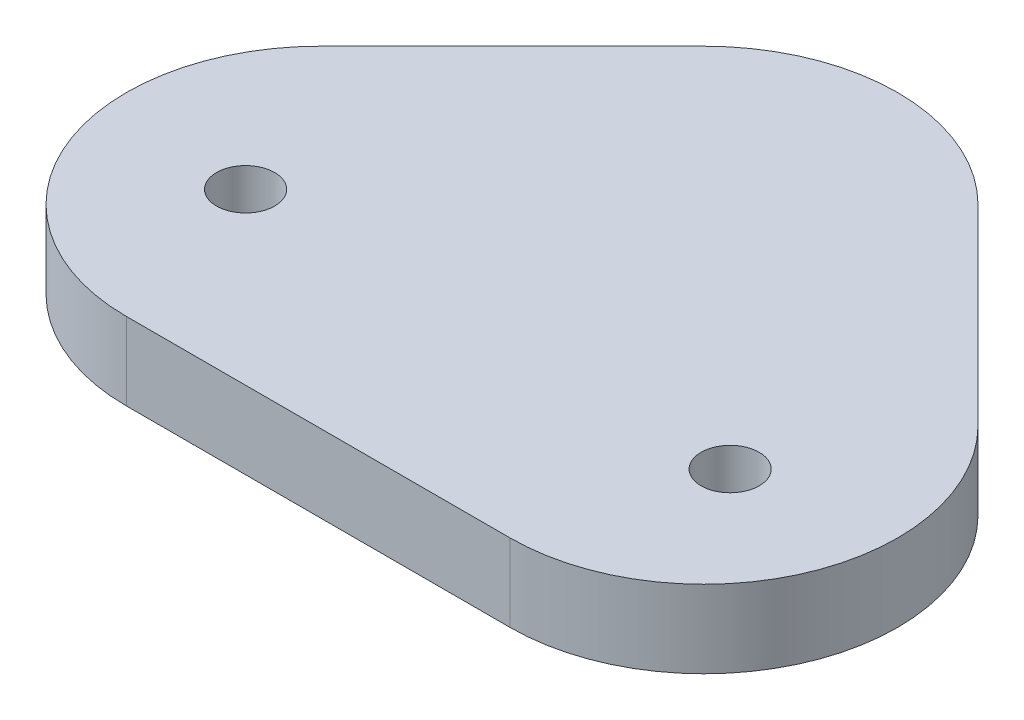
ISO-10303-21;
HEADER;
FILE_DESCRIPTION(('STEP AP214'),'2;1');
FILE_NAME('part.step','',(''),(''),'','','');
FILE_SCHEMA(('AUTOMOTIVE_DESIGN { 1 0 10303 214 1 1 1 1 }'));
ENDSEC;
DATA;
#1=APPLICATION_CONTEXT('core data for automotive mechanical design processes');
#2=APPLICATION_PROTOCOL_DEFINITION('international standard','automotive_design',2000,#1);
#3=PRODUCT_CONTEXT('',#1,'mechanical');
#4=PRODUCT('Part','Part','',(#3));
#5=PRODUCT_RELATED_PRODUCT_CATEGORY('part','',(#4));
#6=PRODUCT_DEFINITION_FORMATION('','',#4);
#7=PRODUCT_DEFINITION_CONTEXT('part definition',#1,'design');
#8=PRODUCT_DEFINITION('design','',#6,#7);
#9=PRODUCT_DEFINITION_SHAPE('','',#8);
#10=(LENGTH_UNIT() NAMED_UNIT(*) SI_UNIT(.MILLI.,.METRE.));
#11=(NAMED_UNIT(*) PLANE_ANGLE_UNIT() SI_UNIT($,.RADIAN.));
#12=(NAMED_UNIT(*) SI_UNIT($,.STERADIAN.) SOLID_ANGLE_UNIT());
#13=UNCERTAINTY_MEASURE_WITH_UNIT(LENGTH_MEASURE(1.E-05),#10,'distance_accuracy_value','');
#14=(GEOMETRIC_REPRESENTATION_CONTEXT(3) GLOBAL_UNCERTAINTY_ASSIGNED_CONTEXT((#13)) GLOBAL_UNIT_ASSIGNED_CONTEXT((#10,
#11,#12)) REPRESENTATION_CONTEXT('',''));
#15=CARTESIAN_POINT('',(0.,0.,0.));
#16=DIRECTION('',(0.,0.,1.));
#17=DIRECTION('',(1.,0.,0.));
#18=AXIS2_PLACEMENT_3D('',#15,#16,#17);
#19=CARTESIAN_POINT('',(34.0416305603426,4.,-19.8994949366117));
#20=DIRECTION('',(0.,-1.,0.));
#21=DIRECTION('',(0.,0.,-1.));
#22=AXIS2_PLACEMENT_3D('',#19,#20,#21);
#23=CYLINDRICAL_SURFACE('',#22,9.99999999999999);
#24=CARTESIAN_POINT('',(34.0416305603426,0.,-19.8994949366117));
#25=DIRECTION('',(0.,1.,0.));
#26=DIRECTION('',(0.,0.,-1.));
#27=AXIS2_PLACEMENT_3D('',#24,#25,#26);
#28=CIRCLE('',#27,9.99999999999999);
#29=CARTESIAN_POINT('',(41.112698372208,0.,-26.9705627484771));
#30=VERTEX_POINT('',#29);
#31=CARTESIAN_POINT('',(26.9705627484771,0.,-26.9705627484772));
#32=VERTEX_POINT('',#31);
#33=EDGE_CURVE('E128',#30,#32,#28,.T.);
#34=ORIENTED_EDGE('',*,*,#33,.T.);
#35=DIRECTION('',(0.,-1.,0.));
#36=VECTOR('',#35,1.);
#37=CARTESIAN_POINT('',(26.9705627484771,4.,-26.9705627484772));
#38=LINE('',#37,#36);
#39=CARTESIAN_POINT('',(26.9705627484771,4.,-26.9705627484772));
#40=VERTEX_POINT('',#39);
#41=EDGE_CURVE('E11',#40,#32,#38,.T.);
#42=ORIENTED_EDGE('',*,*,#41,.F.);
#43=CARTESIAN_POINT('',(34.0416305603426,4.,-19.8994949366117));
#44=DIRECTION('',(0.,1.,0.));
#45=DIRECTION('',(0.,0.,-1.));
#46=AXIS2_PLACEMENT_3D('',#43,#44,#45);
#47=CIRCLE('',#46,9.99999999999999);
#48=CARTESIAN_POINT('',(41.112698372208,4.,-26.9705627484771));
#49=VERTEX_POINT('',#48);
#50=EDGE_CURVE('E145',#49,#40,#47,.T.);
#51=ORIENTED_EDGE('',*,*,#50,.F.);
#52=DIRECTION('',(0.,-1.,0.));
#53=VECTOR('',#52,1.);
#54=CARTESIAN_POINT('',(41.112698372208,4.,-26.9705627484771));
#55=LINE('',#54,#53);
#56=EDGE_CURVE('E124',#49,#30,#55,.T.);
#57=ORIENTED_EDGE('',*,*,#56,.T.);
#58=EDGE_LOOP('',(#34,#42,#51,#57));
#59=FACE_BOUND('',#58,.T.);
#60=ADVANCED_FACE('F39',(#59),#23,.T.);
#61=CARTESIAN_POINT('',(26.9705627484771,4.,-26.9705627484772));
#62=DIRECTION('',(0.70710678118655,0.,0.707106781186545));
#63=DIRECTION('',(0.707106781186545,0.,-0.70710678118655));
#64=AXIS2_PLACEMENT_3D('',#61,#62,#63);
#65=PLANE('',#64);
#66=DIRECTION('',(-0.707106781186545,0.,0.70710678118655));
#67=VECTOR('',#66,1.);
#68=CARTESIAN_POINT('',(26.9705627484771,0.,-26.9705627484772));
#69=LINE('',#68,#67);
#70=CARTESIAN_POINT('',(17.0710678118655,0.,-17.0710678118655));
#71=VERTEX_POINT('',#70);
#72=EDGE_CURVE('E132',#32,#71,#69,.T.);
#73=ORIENTED_EDGE('',*,*,#72,.T.);
#74=DIRECTION('',(0.,-1.,0.));
#75=VECTOR('',#74,1.);
#76=CARTESIAN_POINT('',(17.0710678118655,4.,-17.0710678118655));
#77=LINE('',#76,#75);
#78=CARTESIAN_POINT('',(17.0710678118655,4.,-17.0710678118655));
#79=VERTEX_POINT('',#78);
#80=EDGE_CURVE('E48',#79,#71,#77,.T.);
#81=ORIENTED_EDGE('',*,*,#80,.F.);
#82=DIRECTION('',(-0.707106781186545,0.,0.70710678118655));
#83=VECTOR('',#82,1.);
#84=CARTESIAN_POINT('',(26.9705627484771,4.,-26.9705627484772));
#85=LINE('',#84,#83);
#86=EDGE_CURVE('E93',#40,#79,#85,.T.);
#87=ORIENTED_EDGE('',*,*,#86,.F.);
#88=ORIENTED_EDGE('',*,*,#41,.T.);
#89=EDGE_LOOP('',(#73,#81,#87,#88));
#90=FACE_BOUND('',#89,.T.);
#91=ADVANCED_FACE('F174',(#90),#65,.F.);
#92=CARTESIAN_POINT('',(24.142135623731,4.,-10.));
#93=DIRECTION('',(0.,-1.,0.));
#94=DIRECTION('',(0.,0.,-1.));
#95=AXIS2_PLACEMENT_3D('',#92,#93,#94);
#96=CYLINDRICAL_SURFACE('',#95,10.);
#97=CARTESIAN_POINT('',(24.142135623731,0.,-10.));
#98=DIRECTION('',(0.,1.,0.));
#99=DIRECTION('',(0.,0.,1.));
#100=AXIS2_PLACEMENT_3D('',#97,#98,#99);
#101=CIRCLE('',#100,10.);
#102=CARTESIAN_POINT('',(24.142135623731,0.,0.));
#103=VERTEX_POINT('',#102);
#104=EDGE_CURVE('E136',#71,#103,#101,.T.);
#105=ORIENTED_EDGE('',*,*,#104,.T.);
#106=DIRECTION('',(0.,-1.,0.));
#107=VECTOR('',#106,1.);
#108=CARTESIAN_POINT('',(24.142135623731,4.,0.));
#109=LINE('',#108,#107);
#110=CARTESIAN_POINT('',(24.142135623731,4.,0.));
#111=VERTEX_POINT('',#110);
#112=EDGE_CURVE('E117',#111,#103,#109,.T.);
#113=ORIENTED_EDGE('',*,*,#112,.F.);
#114=CARTESIAN_POINT('',(24.142135623731,4.,-10.));
#115=DIRECTION('',(0.,1.,0.));
#116=DIRECTION('',(0.,0.,1.));
#117=AXIS2_PLACEMENT_3D('',#114,#115,#116);
#118=CIRCLE('',#117,10.);
#119=EDGE_CURVE('E106',#79,#111,#118,.T.);
#120=ORIENTED_EDGE('',*,*,#119,.F.);
#121=ORIENTED_EDGE('',*,*,#80,.T.);
#122=EDGE_LOOP('',(#105,#113,#120,#121));
#123=FACE_BOUND('',#122,.T.);
#124=ADVANCED_FACE('F155',(#123),#96,.T.);
#125=CARTESIAN_POINT('',(24.142135623731,4.,0.));
#126=DIRECTION('',(0.,0.,-1.));
#127=DIRECTION('',(-1.,0.,0.));
#128=AXIS2_PLACEMENT_3D('',#125,#126,#127);
#129=PLANE('',#128);
#130=DIRECTION('',(1.,0.,0.));
#131=VECTOR('',#130,1.);
#132=CARTESIAN_POINT('',(24.142135623731,0.,0.));
#133=LINE('',#132,#131);
#134=CARTESIAN_POINT('',(43.9411254969542,0.,0.));
#135=VERTEX_POINT('',#134);
#136=EDGE_CURVE('E115',#103,#135,#133,.T.);
#137=ORIENTED_EDGE('',*,*,#136,.T.);
#138=DIRECTION('',(0.,-1.,0.));
#139=VECTOR('',#138,1.);
#140=CARTESIAN_POINT('',(43.9411254969542,4.,0.));
#141=LINE('',#140,#139);
#142=CARTESIAN_POINT('',(43.9411254969542,4.,0.));
#143=VERTEX_POINT('',#142);
#144=EDGE_CURVE('E112',#143,#135,#141,.T.);
#145=ORIENTED_EDGE('',*,*,#144,.F.);
#146=DIRECTION('',(1.,0.,0.));
#147=VECTOR('',#146,1.);
#148=CARTESIAN_POINT('',(24.142135623731,4.,0.));
#149=LINE('',#148,#147);
#150=EDGE_CURVE('E100',#111,#143,#149,.T.);
#151=ORIENTED_EDGE('',*,*,#150,.F.);
#152=ORIENTED_EDGE('',*,*,#112,.T.);
#153=EDGE_LOOP('',(#137,#145,#151,#152));
#154=FACE_BOUND('',#153,.T.);
#155=ADVANCED_FACE('F113',(#154),#129,.F.);
#156=CARTESIAN_POINT('',(43.9411254969542,4.,-10.));
#157=DIRECTION('',(0.,-1.,0.));
#158=DIRECTION('',(0.,0.,-1.));
#159=AXIS2_PLACEMENT_3D('',#156,#157,#158);
#160=CYLINDRICAL_SURFACE('',#159,10.);
#161=CARTESIAN_POINT('',(43.9411254969542,0.,-10.));
#162=DIRECTION('',(0.,1.,0.));
#163=DIRECTION('',(0.,0.,1.));
#164=AXIS2_PLACEMENT_3D('',#161,#162,#163);
#165=CIRCLE('',#164,10.);
#166=CARTESIAN_POINT('',(51.0121933088197,0.,-17.0710678118655));
#167=VERTEX_POINT('',#166);
#168=EDGE_CURVE('E79',#135,#167,#165,.T.);
#169=ORIENTED_EDGE('',*,*,#168,.T.);
#170=DIRECTION('',(0.,-1.,0.));
#171=VECTOR('',#170,1.);
#172=CARTESIAN_POINT('',(51.0121933088197,4.,-17.0710678118655));
#173=LINE('',#172,#171);
#174=CARTESIAN_POINT('',(51.0121933088197,4.,-17.0710678118655));
#175=VERTEX_POINT('',#174);
#176=EDGE_CURVE('E118',#175,#167,#173,.T.);
#177=ORIENTED_EDGE('',*,*,#176,.F.);
#178=CARTESIAN_POINT('',(43.9411254969542,4.,-10.));
#179=DIRECTION('',(0.,1.,0.));
#180=DIRECTION('',(0.,0.,1.));
#181=AXIS2_PLACEMENT_3D('',#178,#179,#180);
#182=CIRCLE('',#181,10.);
#183=EDGE_CURVE('E104',#143,#175,#182,.T.);
#184=ORIENTED_EDGE('',*,*,#183,.F.);
#185=ORIENTED_EDGE('',*,*,#144,.T.);
#186=EDGE_LOOP('',(#169,#177,#184,#185));
#187=FACE_BOUND('',#186,.T.);
#188=ADVANCED_FACE('F120',(#187),#160,.T.);
#189=CARTESIAN_POINT('',(51.0121933088197,4.,-17.0710678118655));
#190=DIRECTION('',(-0.707106781186548,0.,0.707106781186547));
#191=DIRECTION('',(0.707106781186547,0.,0.707106781186548));
#192=AXIS2_PLACEMENT_3D('',#189,#190,#191);
#193=PLANE('',#192);
#194=DIRECTION('',(-0.707106781186547,0.,-0.707106781186548));
#195=VECTOR('',#194,1.);
#196=CARTESIAN_POINT('',(51.0121933088197,0.,-17.0710678118655));
#197=LINE('',#196,#195);
#198=EDGE_CURVE('E85',#167,#30,#197,.T.);
#199=ORIENTED_EDGE('',*,*,#198,.T.);
#200=ORIENTED_EDGE('',*,*,#56,.F.);
#201=DIRECTION('',(-0.707106781186547,0.,-0.707106781186548));
#202=VECTOR('',#201,1.);
#203=CARTESIAN_POINT('',(51.0121933088197,4.,-17.0710678118655));
#204=LINE('',#203,#202);
#205=EDGE_CURVE('E56',#175,#49,#204,.T.);
#206=ORIENTED_EDGE('',*,*,#205,.F.);
#207=ORIENTED_EDGE('',*,*,#176,.T.);
#208=EDGE_LOOP('',(#199,#200,#206,#207));
#209=FACE_BOUND('',#208,.T.);
#210=ADVANCED_FACE('F162',(#209),#193,.F.);
#211=CARTESIAN_POINT('',(34.0416305603426,4.,-19.8994949366117));
#212=DIRECTION('',(0.,-1.,0.));
#213=DIRECTION('',(0.,0.,-1.));
#214=AXIS2_PLACEMENT_3D('',#211,#212,#213);
#215=PLANE('',#214);
#216=CARTESIAN_POINT('',(21.5416305603426,4.,-8.75498160842512));
#217=DIRECTION('',(0.,-1.,0.));
#218=DIRECTION('',(0.,0.,-1.));
#219=AXIS2_PLACEMENT_3D('',#216,#217,#218);
#220=CIRCLE('',#219,1.5);
#221=CARTESIAN_POINT('',(21.5416305603426,4.,-10.2549816084251));
#222=VERTEX_POINT('',#221);
#223=EDGE_CURVE('E133',#222,#222,#220,.T.);
#224=ORIENTED_EDGE('',*,*,#223,.T.);
#225=EDGE_LOOP('',(#224));
#226=FACE_BOUND('',#225,.T.);
#227=CARTESIAN_POINT('',(46.5416305603426,4.,-8.75498160842512));
#228=DIRECTION('',(0.,-1.,0.));
#229=DIRECTION('',(0.,0.,-1.));
#230=AXIS2_PLACEMENT_3D('',#227,#228,#229);
#231=CIRCLE('',#230,1.5);
#232=CARTESIAN_POINT('',(46.5416305603426,4.,-10.2549816084251));
#233=VERTEX_POINT('',#232);
#234=EDGE_CURVE('E241',#233,#233,#231,.T.);
#235=ORIENTED_EDGE('',*,*,#234,.T.);
#236=EDGE_LOOP('',(#235));
#237=FACE_BOUND('',#236,.T.);
#238=ORIENTED_EDGE('',*,*,#50,.T.);
#239=ORIENTED_EDGE('',*,*,#86,.T.);
#240=ORIENTED_EDGE('',*,*,#119,.T.);
#241=ORIENTED_EDGE('',*,*,#150,.T.);
#242=ORIENTED_EDGE('',*,*,#183,.T.);
#243=ORIENTED_EDGE('',*,*,#205,.T.);
#244=EDGE_LOOP('',(#238,#239,#240,#241,#242,#243));
#245=FACE_BOUND('',#244,.T.);
#246=ADVANCED_FACE('F102',(#226,#237,#245),#215,.F.);
#247=CARTESIAN_POINT('',(34.0416305603426,0.,-19.8994949366117));
#248=DIRECTION('',(0.,-1.,0.));
#249=DIRECTION('',(0.,0.,-1.));
#250=AXIS2_PLACEMENT_3D('',#247,#248,#249);
#251=PLANE('',#250);
#252=CARTESIAN_POINT('',(21.5416305603426,0.,-8.75498160842512));
#253=DIRECTION('',(0.,1.,0.));
#254=DIRECTION('',(0.,0.,1.));
#255=AXIS2_PLACEMENT_3D('',#252,#253,#254);
#256=CIRCLE('',#255,1.5);
#257=CARTESIAN_POINT('',(21.5416305603426,0.,-7.25498160842512));
#258=VERTEX_POINT('',#257);
#259=EDGE_CURVE('E239',#258,#258,#256,.T.);
#260=ORIENTED_EDGE('',*,*,#259,.T.);
#261=EDGE_LOOP('',(#260));
#262=FACE_BOUND('',#261,.T.);
#263=CARTESIAN_POINT('',(46.5416305603426,0.,-8.75498160842512));
#264=DIRECTION('',(0.,1.,0.));
#265=DIRECTION('',(0.,0.,-1.));
#266=AXIS2_PLACEMENT_3D('',#263,#264,#265);
#267=CIRCLE('',#266,1.5);
#268=CARTESIAN_POINT('',(46.5416305603426,0.,-10.2549816084251));
#269=VERTEX_POINT('',#268);
#270=EDGE_CURVE('E247',#269,#269,#267,.T.);
#271=ORIENTED_EDGE('',*,*,#270,.T.);
#272=EDGE_LOOP('',(#271));
#273=FACE_BOUND('',#272,.T.);
#274=ORIENTED_EDGE('',*,*,#33,.F.);
#275=ORIENTED_EDGE('',*,*,#198,.F.);
#276=ORIENTED_EDGE('',*,*,#168,.F.);
#277=ORIENTED_EDGE('',*,*,#136,.F.);
#278=ORIENTED_EDGE('',*,*,#104,.F.);
#279=ORIENTED_EDGE('',*,*,#72,.F.);
#280=EDGE_LOOP('',(#274,#275,#276,#277,#278,#279));
#281=FACE_BOUND('',#280,.T.);
#282=ADVANCED_FACE('F158',(#262,#273,#281),#251,.T.);
#283=CARTESIAN_POINT('',(46.5416305603426,8.24264068711929,-8.75498160842512));
#284=DIRECTION('',(0.,-1.,0.));
#285=DIRECTION('',(0.,0.,-1.));
#286=AXIS2_PLACEMENT_3D('',#283,#284,#285);
#287=CYLINDRICAL_SURFACE('',#286,1.5);
#288=ORIENTED_EDGE('',*,*,#234,.F.);
#289=EDGE_LOOP('',(#288));
#290=FACE_BOUND('',#289,.T.);
#291=ORIENTED_EDGE('',*,*,#270,.F.);
#292=EDGE_LOOP('',(#291));
#293=FACE_BOUND('',#292,.T.);
#294=ADVANCED_FACE('F211',(#290,#293),#287,.F.);
#295=CARTESIAN_POINT('',(21.5416305603426,8.24264068711929,-8.75498160842512));
#296=DIRECTION('',(0.,-1.,0.));
#297=DIRECTION('',(0.,0.,-1.));
#298=AXIS2_PLACEMENT_3D('',#295,#296,#297);
#299=CYLINDRICAL_SURFACE('',#298,1.5);
#300=ORIENTED_EDGE('',*,*,#223,.F.);
#301=EDGE_LOOP('',(#300));
#302=FACE_BOUND('',#301,.T.);
#303=ORIENTED_EDGE('',*,*,#259,.F.);
#304=EDGE_LOOP('',(#303));
#305=FACE_BOUND('',#304,.T.);
#306=ADVANCED_FACE('F220',(#302,#305),#299,.F.);
#307=CLOSED_SHELL('',(#60,#91,#124,#155,#188,#210,#246,#282,#294,#306));
#308=MANIFOLD_SOLID_BREP('B2',#307);
#309=ADVANCED_BREP_SHAPE_REPRESENTATION('',(#18,#308),#14);
#310=SHAPE_DEFINITION_REPRESENTATION(#9,#309);
ENDSEC;
END-ISO-10303-21;
